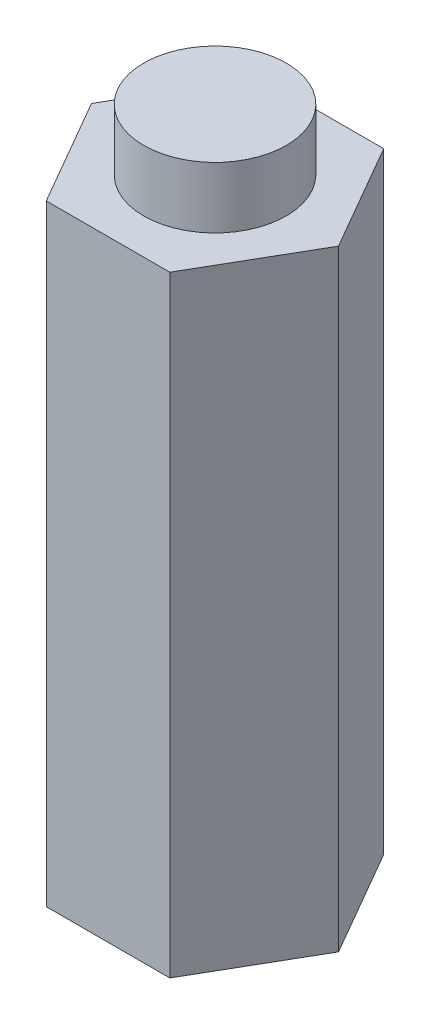
ISO-10303-21;
HEADER;
FILE_DESCRIPTION(('STEP AP214'),'2;1');
FILE_NAME('part.step','',(''),(''),'','','');
FILE_SCHEMA(('AUTOMOTIVE_DESIGN { 1 0 10303 214 1 1 1 1 }'));
ENDSEC;
DATA;
#1=APPLICATION_CONTEXT('core data for automotive mechanical design processes');
#2=APPLICATION_PROTOCOL_DEFINITION('international standard','automotive_design',2000,#1);
#3=PRODUCT_CONTEXT('',#1,'mechanical');
#4=PRODUCT('Part','Part','',(#3));
#5=PRODUCT_RELATED_PRODUCT_CATEGORY('part','',(#4));
#6=PRODUCT_DEFINITION_FORMATION('','',#4);
#7=PRODUCT_DEFINITION_CONTEXT('part definition',#1,'design');
#8=PRODUCT_DEFINITION('design','',#6,#7);
#9=PRODUCT_DEFINITION_SHAPE('','',#8);
#10=(LENGTH_UNIT() NAMED_UNIT(*) SI_UNIT(.MILLI.,.METRE.));
#11=(NAMED_UNIT(*) PLANE_ANGLE_UNIT() SI_UNIT($,.RADIAN.));
#12=(NAMED_UNIT(*) SI_UNIT($,.STERADIAN.) SOLID_ANGLE_UNIT());
#13=UNCERTAINTY_MEASURE_WITH_UNIT(LENGTH_MEASURE(1.E-05),#10,'distance_accuracy_value','');
#14=(GEOMETRIC_REPRESENTATION_CONTEXT(3) GLOBAL_UNCERTAINTY_ASSIGNED_CONTEXT((#13)) GLOBAL_UNIT_ASSIGNED_CONTEXT((#10,
#11,#12)) REPRESENTATION_CONTEXT('',''));
#15=CARTESIAN_POINT('',(0.,0.,0.));
#16=DIRECTION('',(0.,0.,1.));
#17=DIRECTION('',(1.,0.,0.));
#18=AXIS2_PLACEMENT_3D('',#15,#16,#17);
#19=CARTESIAN_POINT('',(6.06217782649113,60.,10.5));
#20=DIRECTION('',(-0.866025403784442,0.,-0.499999999999995));
#21=DIRECTION('',(-0.499999999999995,0.,0.866025403784442));
#22=AXIS2_PLACEMENT_3D('',#19,#20,#21);
#23=PLANE('',#22);
#24=DIRECTION('',(0.499999999999995,0.,-0.866025403784442));
#25=VECTOR('',#24,1.);
#26=CARTESIAN_POINT('',(6.06217782649113,0.,10.5));
#27=LINE('',#26,#25);
#28=CARTESIAN_POINT('',(6.06217782649113,0.,10.5));
#29=VERTEX_POINT('',#28);
#30=CARTESIAN_POINT('',(12.1243556529821,0.,0.));
#31=VERTEX_POINT('',#30);
#32=EDGE_CURVE('E134',#29,#31,#27,.T.);
#33=ORIENTED_EDGE('',*,*,#32,.T.);
#34=DIRECTION('',(0.,-1.,0.));
#35=VECTOR('',#34,1.);
#36=CARTESIAN_POINT('',(12.1243556529821,60.,0.));
#37=LINE('',#36,#35);
#38=CARTESIAN_POINT('',(12.1243556529821,60.,0.));
#39=VERTEX_POINT('',#38);
#40=EDGE_CURVE('E46',#39,#31,#37,.T.);
#41=ORIENTED_EDGE('',*,*,#40,.F.);
#42=DIRECTION('',(0.499999999999995,0.,-0.866025403784442));
#43=VECTOR('',#42,1.);
#44=CARTESIAN_POINT('',(6.06217782649113,60.,10.5));
#45=LINE('',#44,#43);
#46=CARTESIAN_POINT('',(6.06217782649113,60.,10.5));
#47=VERTEX_POINT('',#46);
#48=EDGE_CURVE('E151',#47,#39,#45,.T.);
#49=ORIENTED_EDGE('',*,*,#48,.F.);
#50=DIRECTION('',(0.,-1.,0.));
#51=VECTOR('',#50,1.);
#52=CARTESIAN_POINT('',(6.06217782649113,60.,10.5));
#53=LINE('',#52,#51);
#54=EDGE_CURVE('E130',#47,#29,#53,.T.);
#55=ORIENTED_EDGE('',*,*,#54,.T.);
#56=EDGE_LOOP('',(#33,#41,#49,#55));
#57=FACE_BOUND('',#56,.T.);
#58=ADVANCED_FACE('F43',(#57),#23,.F.);
#59=CARTESIAN_POINT('',(12.1243556529821,60.,0.));
#60=DIRECTION('',(-0.866025403784435,0.,0.500000000000005));
#61=DIRECTION('',(0.500000000000005,0.,0.866025403784436));
#62=AXIS2_PLACEMENT_3D('',#59,#60,#61);
#63=PLANE('',#62);
#64=DIRECTION('',(-0.500000000000005,0.,-0.866025403784436));
#65=VECTOR('',#64,1.);
#66=CARTESIAN_POINT('',(12.1243556529821,0.,0.));
#67=LINE('',#66,#65);
#68=CARTESIAN_POINT('',(6.06217782649101,0.,-10.5));
#69=VERTEX_POINT('',#68);
#70=EDGE_CURVE('E138',#31,#69,#67,.T.);
#71=ORIENTED_EDGE('',*,*,#70,.T.);
#72=DIRECTION('',(0.,-1.,0.));
#73=VECTOR('',#72,1.);
#74=CARTESIAN_POINT('',(6.06217782649101,60.,-10.5));
#75=LINE('',#74,#73);
#76=CARTESIAN_POINT('',(6.06217782649101,60.,-10.5));
#77=VERTEX_POINT('',#76);
#78=EDGE_CURVE('E157',#77,#69,#75,.T.);
#79=ORIENTED_EDGE('',*,*,#78,.F.);
#80=DIRECTION('',(-0.500000000000005,0.,-0.866025403784436));
#81=VECTOR('',#80,1.);
#82=CARTESIAN_POINT('',(12.1243556529821,60.,0.));
#83=LINE('',#82,#81);
#84=EDGE_CURVE('E99',#39,#77,#83,.T.);
#85=ORIENTED_EDGE('',*,*,#84,.F.);
#86=ORIENTED_EDGE('',*,*,#40,.T.);
#87=EDGE_LOOP('',(#71,#79,#85,#86));
#88=FACE_BOUND('',#87,.T.);
#89=ADVANCED_FACE('F164',(#88),#63,.F.);
#90=CARTESIAN_POINT('',(6.06217782649101,60.,-10.5));
#91=DIRECTION('',(0.,0.,1.));
#92=DIRECTION('',(1.,0.,0.));
#93=AXIS2_PLACEMENT_3D('',#90,#91,#92);
#94=PLANE('',#93);
#95=DIRECTION('',(-1.,0.,0.));
#96=VECTOR('',#95,1.);
#97=CARTESIAN_POINT('',(6.06217782649101,0.,-10.5));
#98=LINE('',#97,#96);
#99=CARTESIAN_POINT('',(-6.06217782649114,0.,-10.5));
#100=VERTEX_POINT('',#99);
#101=EDGE_CURVE('E142',#69,#100,#98,.T.);
#102=ORIENTED_EDGE('',*,*,#101,.T.);
#103=DIRECTION('',(0.,-1.,0.));
#104=VECTOR('',#103,1.);
#105=CARTESIAN_POINT('',(-6.06217782649114,60.,-10.5));
#106=LINE('',#105,#104);
#107=CARTESIAN_POINT('',(-6.06217782649114,60.,-10.5));
#108=VERTEX_POINT('',#107);
#109=EDGE_CURVE('E123',#108,#100,#106,.T.);
#110=ORIENTED_EDGE('',*,*,#109,.F.);
#111=DIRECTION('',(-1.,0.,0.));
#112=VECTOR('',#111,1.);
#113=CARTESIAN_POINT('',(6.06217782649101,60.,-10.5));
#114=LINE('',#113,#112);
#115=EDGE_CURVE('E112',#77,#108,#114,.T.);
#116=ORIENTED_EDGE('',*,*,#115,.F.);
#117=ORIENTED_EDGE('',*,*,#78,.T.);
#118=EDGE_LOOP('',(#102,#110,#116,#117));
#119=FACE_BOUND('',#118,.T.);
#120=ADVANCED_FACE('F170',(#119),#94,.F.);
#121=CARTESIAN_POINT('',(-6.06217782649114,60.,-10.5));
#122=DIRECTION('',(0.866025403784442,0.,0.499999999999994));
#123=DIRECTION('',(0.499999999999995,0.,-0.866025403784442));
#124=AXIS2_PLACEMENT_3D('',#121,#122,#123);
#125=PLANE('',#124);
#126=DIRECTION('',(-0.499999999999995,0.,0.866025403784442));
#127=VECTOR('',#126,1.);
#128=CARTESIAN_POINT('',(-6.06217782649114,0.,-10.5));
#129=LINE('',#128,#127);
#130=CARTESIAN_POINT('',(-12.1243556529821,0.,0.));
#131=VERTEX_POINT('',#130);
#132=EDGE_CURVE('E121',#100,#131,#129,.T.);
#133=ORIENTED_EDGE('',*,*,#132,.T.);
#134=DIRECTION('',(0.,-1.,0.));
#135=VECTOR('',#134,1.);
#136=CARTESIAN_POINT('',(-12.1243556529821,60.,0.));
#137=LINE('',#136,#135);
#138=CARTESIAN_POINT('',(-12.1243556529821,60.,0.));
#139=VERTEX_POINT('',#138);
#140=EDGE_CURVE('E118',#139,#131,#137,.T.);
#141=ORIENTED_EDGE('',*,*,#140,.F.);
#142=DIRECTION('',(-0.499999999999995,0.,0.866025403784442));
#143=VECTOR('',#142,1.);
#144=CARTESIAN_POINT('',(-6.06217782649114,60.,-10.5));
#145=LINE('',#144,#143);
#146=EDGE_CURVE('E106',#108,#139,#145,.T.);
#147=ORIENTED_EDGE('',*,*,#146,.F.);
#148=ORIENTED_EDGE('',*,*,#109,.T.);
#149=EDGE_LOOP('',(#133,#141,#147,#148));
#150=FACE_BOUND('',#149,.T.);
#151=ADVANCED_FACE('F119',(#150),#125,.F.);
#152=CARTESIAN_POINT('',(-12.1243556529821,60.,0.));
#153=DIRECTION('',(0.866025403784435,0.,-0.500000000000006));
#154=DIRECTION('',(-0.500000000000006,0.,-0.866025403784435));
#155=AXIS2_PLACEMENT_3D('',#152,#153,#154);
#156=PLANE('',#155);
#157=DIRECTION('',(0.500000000000006,0.,0.866025403784435));
#158=VECTOR('',#157,1.);
#159=CARTESIAN_POINT('',(-12.1243556529821,0.,0.));
#160=LINE('',#159,#158);
#161=CARTESIAN_POINT('',(-6.06217782649101,0.,10.5));
#162=VERTEX_POINT('',#161);
#163=EDGE_CURVE('E84',#131,#162,#160,.T.);
#164=ORIENTED_EDGE('',*,*,#163,.T.);
#165=DIRECTION('',(0.,-1.,0.));
#166=VECTOR('',#165,1.);
#167=CARTESIAN_POINT('',(-6.06217782649101,60.,10.5));
#168=LINE('',#167,#166);
#169=CARTESIAN_POINT('',(-6.06217782649101,60.,10.5));
#170=VERTEX_POINT('',#169);
#171=EDGE_CURVE('E124',#170,#162,#168,.T.);
#172=ORIENTED_EDGE('',*,*,#171,.F.);
#173=DIRECTION('',(0.500000000000006,0.,0.866025403784435));
#174=VECTOR('',#173,1.);
#175=CARTESIAN_POINT('',(-12.1243556529821,60.,0.));
#176=LINE('',#175,#174);
#177=EDGE_CURVE('E110',#139,#170,#176,.T.);
#178=ORIENTED_EDGE('',*,*,#177,.F.);
#179=ORIENTED_EDGE('',*,*,#140,.T.);
#180=EDGE_LOOP('',(#164,#172,#178,#179));
#181=FACE_BOUND('',#180,.T.);
#182=ADVANCED_FACE('F126',(#181),#156,.F.);
#183=CARTESIAN_POINT('',(-6.06217782649101,60.,10.5));
#184=DIRECTION('',(0.,0.,-1.));
#185=DIRECTION('',(-1.,0.,0.));
#186=AXIS2_PLACEMENT_3D('',#183,#184,#185);
#187=PLANE('',#186);
#188=DIRECTION('',(1.,0.,0.));
#189=VECTOR('',#188,1.);
#190=CARTESIAN_POINT('',(-6.06217782649101,0.,10.5));
#191=LINE('',#190,#189);
#192=EDGE_CURVE('E90',#162,#29,#191,.T.);
#193=ORIENTED_EDGE('',*,*,#192,.T.);
#194=ORIENTED_EDGE('',*,*,#54,.F.);
#195=DIRECTION('',(1.,0.,0.));
#196=VECTOR('',#195,1.);
#197=CARTESIAN_POINT('',(-6.06217782649101,60.,10.5));
#198=LINE('',#197,#196);
#199=EDGE_CURVE('E61',#170,#47,#198,.T.);
#200=ORIENTED_EDGE('',*,*,#199,.F.);
#201=ORIENTED_EDGE('',*,*,#171,.T.);
#202=EDGE_LOOP('',(#193,#194,#200,#201));
#203=FACE_BOUND('',#202,.T.);
#204=ADVANCED_FACE('F190',(#203),#187,.F.);
#205=CARTESIAN_POINT('',(0.,60.,0.));
#206=DIRECTION('',(0.,1.,0.));
#207=DIRECTION('',(0.,0.,1.));
#208=AXIS2_PLACEMENT_3D('',#205,#206,#207);
#209=PLANE('',#208);
#210=CARTESIAN_POINT('',(0.,60.,0.));
#211=DIRECTION('',(0.,1.,0.));
#212=DIRECTION('',(0.,0.,1.));
#213=AXIS2_PLACEMENT_3D('',#210,#211,#212);
#214=CIRCLE('',#213,7.);
#215=CARTESIAN_POINT('',(0.,60.,7.));
#216=VERTEX_POINT('',#215);
#217=EDGE_CURVE('E11',#216,#216,#214,.T.);
#218=ORIENTED_EDGE('',*,*,#217,.F.);
#219=EDGE_LOOP('',(#218));
#220=FACE_BOUND('',#219,.T.);
#221=ORIENTED_EDGE('',*,*,#48,.T.);
#222=ORIENTED_EDGE('',*,*,#84,.T.);
#223=ORIENTED_EDGE('',*,*,#115,.T.);
#224=ORIENTED_EDGE('',*,*,#146,.T.);
#225=ORIENTED_EDGE('',*,*,#177,.T.);
#226=ORIENTED_EDGE('',*,*,#199,.T.);
#227=EDGE_LOOP('',(#221,#222,#223,#224,#225,#226));
#228=FACE_BOUND('',#227,.T.);
#229=ADVANCED_FACE('F108',(#220,#228),#209,.T.);
#230=CARTESIAN_POINT('',(0.,0.,0.));
#231=DIRECTION('',(0.,1.,0.));
#232=DIRECTION('',(0.,0.,1.));
#233=AXIS2_PLACEMENT_3D('',#230,#231,#232);
#234=PLANE('',#233);
#235=ORIENTED_EDGE('',*,*,#32,.F.);
#236=ORIENTED_EDGE('',*,*,#192,.F.);
#237=ORIENTED_EDGE('',*,*,#163,.F.);
#238=ORIENTED_EDGE('',*,*,#132,.F.);
#239=ORIENTED_EDGE('',*,*,#101,.F.);
#240=ORIENTED_EDGE('',*,*,#70,.F.);
#241=EDGE_LOOP('',(#235,#236,#237,#238,#239,#240));
#242=FACE_BOUND('',#241,.T.);
#243=ADVANCED_FACE('F169',(#242),#234,.F.);
#244=CARTESIAN_POINT('',(0.,66.,0.));
#245=DIRECTION('',(0.,-1.,0.));
#246=DIRECTION('',(0.,0.,-1.));
#247=AXIS2_PLACEMENT_3D('',#244,#245,#246);
#248=CYLINDRICAL_SURFACE('',#247,7.);
#249=CARTESIAN_POINT('',(0.,66.,0.));
#250=DIRECTION('',(0.,1.,0.));
#251=DIRECTION('',(0.,0.,1.));
#252=AXIS2_PLACEMENT_3D('',#249,#250,#251);
#253=CIRCLE('',#252,7.);
#254=CARTESIAN_POINT('',(0.,66.,7.));
#255=VERTEX_POINT('',#254);
#256=EDGE_CURVE('E139',#255,#255,#253,.T.);
#257=ORIENTED_EDGE('',*,*,#256,.F.);
#258=EDGE_LOOP('',(#257));
#259=FACE_BOUND('',#258,.T.);
#260=ORIENTED_EDGE('',*,*,#217,.T.);
#261=EDGE_LOOP('',(#260));
#262=FACE_BOUND('',#261,.T.);
#263=ADVANCED_FACE('F183',(#259,#262),#248,.T.);
#264=CARTESIAN_POINT('',(0.,66.,0.));
#265=DIRECTION('',(0.,1.,0.));
#266=DIRECTION('',(0.,0.,1.));
#267=AXIS2_PLACEMENT_3D('',#264,#265,#266);
#268=PLANE('',#267);
#269=ORIENTED_EDGE('',*,*,#256,.T.);
#270=EDGE_LOOP('',(#269));
#271=FACE_BOUND('',#270,.T.);
#272=ADVANCED_FACE('F181',(#271),#268,.T.);
#273=CLOSED_SHELL('',(#58,#89,#120,#151,#182,#204,#229,#243,#263,#272));
#274=MANIFOLD_SOLID_BREP('B2',#273);
#275=ADVANCED_BREP_SHAPE_REPRESENTATION('',(#18,#274),#14);
#276=SHAPE_DEFINITION_REPRESENTATION(#9,#275);
ENDSEC;
END-ISO-10303-21;
